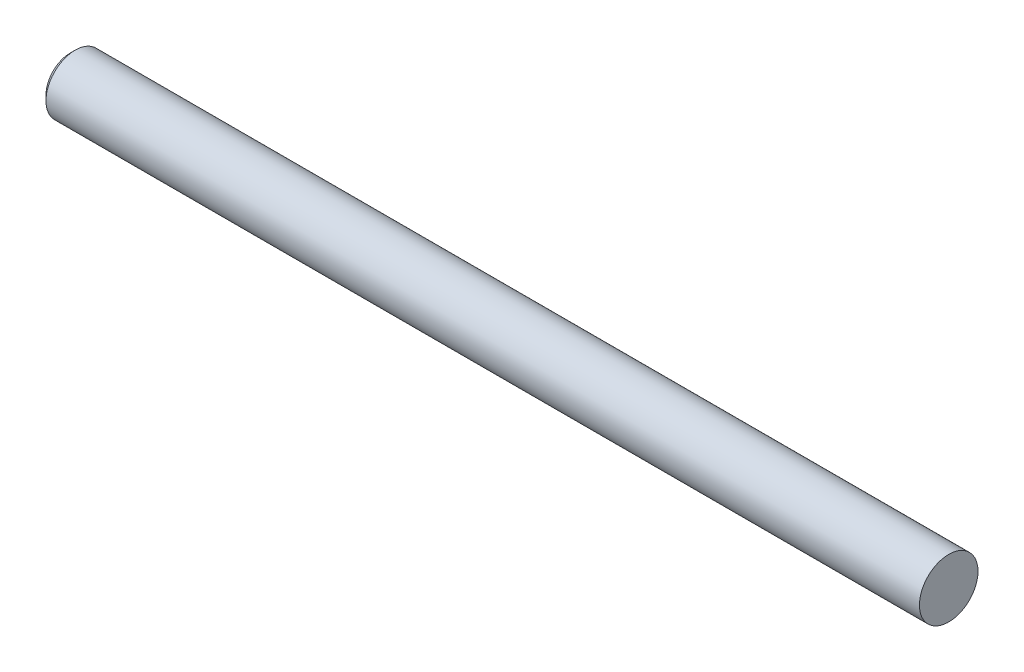
ISO-10303-21;
HEADER;
FILE_DESCRIPTION(('STEP AP214'),'2;1');
FILE_NAME('part.step','',(''),(''),'','','');
FILE_SCHEMA(('AUTOMOTIVE_DESIGN { 1 0 10303 214 1 1 1 1 }'));
ENDSEC;
DATA;
#1=APPLICATION_CONTEXT('core data for automotive mechanical design processes');
#2=APPLICATION_PROTOCOL_DEFINITION('international standard','automotive_design',2000,#1);
#3=PRODUCT_CONTEXT('',#1,'mechanical');
#4=PRODUCT('Part','Part','',(#3));
#5=PRODUCT_RELATED_PRODUCT_CATEGORY('part','',(#4));
#6=PRODUCT_DEFINITION_FORMATION('','',#4);
#7=PRODUCT_DEFINITION_CONTEXT('part definition',#1,'design');
#8=PRODUCT_DEFINITION('design','',#6,#7);
#9=PRODUCT_DEFINITION_SHAPE('','',#8);
#10=(LENGTH_UNIT() NAMED_UNIT(*) SI_UNIT(.MILLI.,.METRE.));
#11=(NAMED_UNIT(*) PLANE_ANGLE_UNIT() SI_UNIT($,.RADIAN.));
#12=(NAMED_UNIT(*) SI_UNIT($,.STERADIAN.) SOLID_ANGLE_UNIT());
#13=UNCERTAINTY_MEASURE_WITH_UNIT(LENGTH_MEASURE(1.E-05),#10,'distance_accuracy_value','');
#14=(GEOMETRIC_REPRESENTATION_CONTEXT(3) GLOBAL_UNCERTAINTY_ASSIGNED_CONTEXT((#13)) GLOBAL_UNIT_ASSIGNED_CONTEXT((#10,
#11,#12)) REPRESENTATION_CONTEXT('',''));
#15=CARTESIAN_POINT('',(0.,0.,0.));
#16=DIRECTION('',(0.,0.,1.));
#17=DIRECTION('',(1.,0.,0.));
#18=AXIS2_PLACEMENT_3D('',#15,#16,#17);
#19=CARTESIAN_POINT('',(120.,0.,0.));
#20=DIRECTION('',(-1.,0.,0.));
#21=DIRECTION('',(0.,0.,1.));
#22=AXIS2_PLACEMENT_3D('',#19,#20,#21);
#23=CYLINDRICAL_SURFACE('',#22,4.);
#24=CARTESIAN_POINT('',(0.676499999999997,0.,0.));
#25=DIRECTION('',(1.,0.,0.));
#26=DIRECTION('',(0.,0.,-1.));
#27=AXIS2_PLACEMENT_3D('',#24,#25,#26);
#28=CIRCLE('',#27,4.);
#29=CARTESIAN_POINT('',(0.676499999999997,0.,-4.));
#30=VERTEX_POINT('',#29);
#31=EDGE_CURVE('E52',#30,#30,#28,.T.);
#32=ORIENTED_EDGE('',*,*,#31,.T.);
#33=EDGE_LOOP('',(#32));
#34=FACE_BOUND('',#33,.T.);
#35=CARTESIAN_POINT('',(120.,0.,0.));
#36=DIRECTION('',(1.,0.,0.));
#37=DIRECTION('',(0.,0.,-1.));
#38=AXIS2_PLACEMENT_3D('',#35,#36,#37);
#39=CIRCLE('',#38,4.);
#40=CARTESIAN_POINT('',(120.,0.,-4.));
#41=VERTEX_POINT('',#40);
#42=EDGE_CURVE('E10',#41,#41,#39,.T.);
#43=ORIENTED_EDGE('',*,*,#42,.F.);
#44=EDGE_LOOP('',(#43));
#45=FACE_BOUND('',#44,.T.);
#46=ADVANCED_FACE('F45',(#34,#45),#23,.T.);
#47=CARTESIAN_POINT('',(120.,0.,0.));
#48=DIRECTION('',(1.,0.,0.));
#49=DIRECTION('',(0.,0.,-1.));
#50=AXIS2_PLACEMENT_3D('',#47,#48,#49);
#51=PLANE('',#50);
#52=ORIENTED_EDGE('',*,*,#42,.T.);
#53=EDGE_LOOP('',(#52));
#54=FACE_BOUND('',#53,.T.);
#55=ADVANCED_FACE('F72',(#54),#51,.T.);
#56=CARTESIAN_POINT('',(0.,0.,0.));
#57=DIRECTION('',(1.,0.,0.));
#58=DIRECTION('',(0.,0.,-1.));
#59=AXIS2_PLACEMENT_3D('',#56,#57,#58);
#60=CONICAL_SURFACE('',#59,3.3235,0.785398163397453);
#61=ORIENTED_EDGE('',*,*,#31,.F.);
#62=EDGE_LOOP('',(#61));
#63=FACE_BOUND('',#62,.T.);
#64=CARTESIAN_POINT('',(0.,0.,0.));
#65=DIRECTION('',(1.,0.,0.));
#66=DIRECTION('',(0.,0.,-1.));
#67=AXIS2_PLACEMENT_3D('',#64,#65,#66);
#68=CIRCLE('',#67,3.3235);
#69=CARTESIAN_POINT('',(0.,0.,-3.3235));
#70=VERTEX_POINT('',#69);
#71=EDGE_CURVE('E57',#70,#70,#68,.T.);
#72=ORIENTED_EDGE('',*,*,#71,.T.);
#73=EDGE_LOOP('',(#72));
#74=FACE_BOUND('',#73,.T.);
#75=ADVANCED_FACE('F65',(#63,#74),#60,.T.);
#76=CARTESIAN_POINT('',(0.,0.,0.));
#77=DIRECTION('',(1.,0.,0.));
#78=DIRECTION('',(0.,0.,-1.));
#79=AXIS2_PLACEMENT_3D('',#76,#77,#78);
#80=PLANE('',#79);
#81=ORIENTED_EDGE('',*,*,#71,.F.);
#82=EDGE_LOOP('',(#81));
#83=FACE_BOUND('',#82,.T.);
#84=ADVANCED_FACE('F67',(#83),#80,.F.);
#85=CLOSED_SHELL('',(#46,#55,#75,#84));
#86=MANIFOLD_SOLID_BREP('B2',#85);
#87=ADVANCED_BREP_SHAPE_REPRESENTATION('',(#18,#86),#14);
#88=SHAPE_DEFINITION_REPRESENTATION(#9,#87);
ENDSEC;
END-ISO-10303-21;
